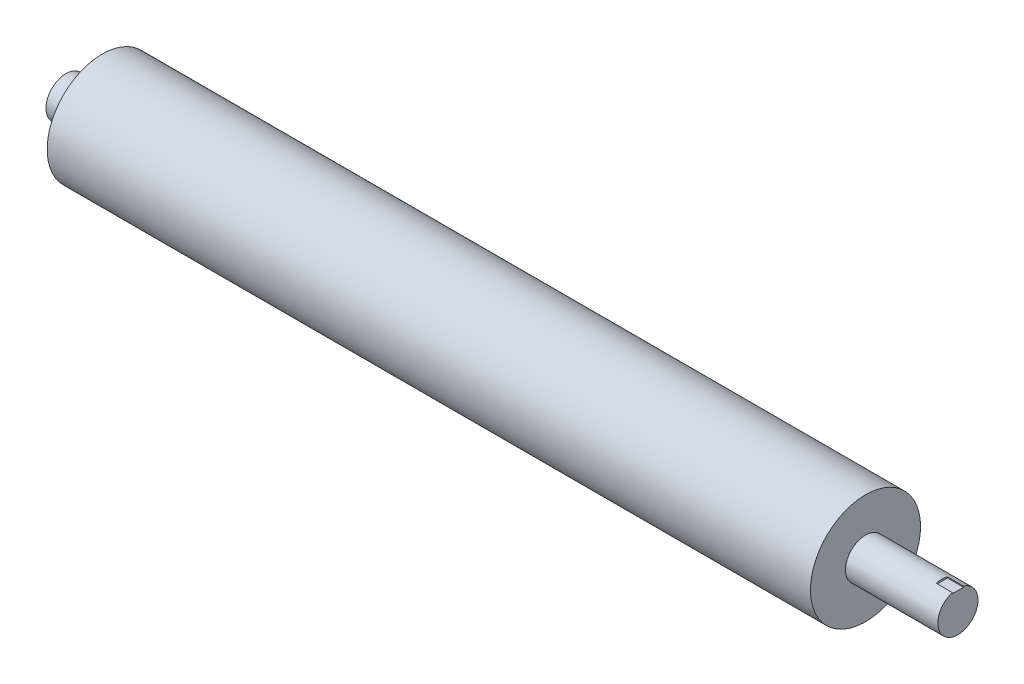
ISO-10303-21;
HEADER;
FILE_DESCRIPTION(('STEP AP214'),'2;1');
FILE_NAME('part.step','',(''),(''),'','','');
FILE_SCHEMA(('AUTOMOTIVE_DESIGN { 1 0 10303 214 1 1 1 1 }'));
ENDSEC;
DATA;
#1=APPLICATION_CONTEXT('core data for automotive mechanical design processes');
#2=APPLICATION_PROTOCOL_DEFINITION('international standard','automotive_design',2000,#1);
#3=PRODUCT_CONTEXT('',#1,'mechanical');
#4=PRODUCT('Part','Part','',(#3));
#5=PRODUCT_RELATED_PRODUCT_CATEGORY('part','',(#4));
#6=PRODUCT_DEFINITION_FORMATION('','',#4);
#7=PRODUCT_DEFINITION_CONTEXT('part definition',#1,'design');
#8=PRODUCT_DEFINITION('design','',#6,#7);
#9=PRODUCT_DEFINITION_SHAPE('','',#8);
#10=(LENGTH_UNIT() NAMED_UNIT(*) SI_UNIT(.MILLI.,.METRE.));
#11=(NAMED_UNIT(*) PLANE_ANGLE_UNIT() SI_UNIT($,.RADIAN.));
#12=(NAMED_UNIT(*) SI_UNIT($,.STERADIAN.) SOLID_ANGLE_UNIT());
#13=UNCERTAINTY_MEASURE_WITH_UNIT(LENGTH_MEASURE(1.E-05),#10,'distance_accuracy_value','');
#14=(GEOMETRIC_REPRESENTATION_CONTEXT(3) GLOBAL_UNCERTAINTY_ASSIGNED_CONTEXT((#13)) GLOBAL_UNIT_ASSIGNED_CONTEXT((#10,
#11,#12)) REPRESENTATION_CONTEXT('',''));
#15=CARTESIAN_POINT('',(0.,0.,0.));
#16=DIRECTION('',(0.,0.,1.));
#17=DIRECTION('',(1.,0.,0.));
#18=AXIS2_PLACEMENT_3D('',#15,#16,#17);
#19=CARTESIAN_POINT('',(1180.,0.,0.));
#20=DIRECTION('',(1.,0.,0.));
#21=DIRECTION('',(0.,0.,-1.));
#22=AXIS2_PLACEMENT_3D('',#19,#20,#21);
#23=PLANE('',#22);
#24=DIRECTION('',(0.,-1.,0.));
#25=VECTOR('',#24,1.);
#26=CARTESIAN_POINT('',(1180.,45.3999999999993,13.9999999999998));
#27=LINE('',#26,#25);
#28=CARTESIAN_POINT('',(1180.,47.9999999999993,13.9999999999998));
#29=VERTEX_POINT('',#28);
#30=CARTESIAN_POINT('',(1180.,45.3999999999993,13.9999999999998));
#31=VERTEX_POINT('',#30);
#32=EDGE_CURVE('E88',#29,#31,#27,.T.);
#33=ORIENTED_EDGE('',*,*,#32,.F.);
#34=CARTESIAN_POINT('',(1180.,0.,-1.44508322299388E-13));
#35=DIRECTION('',(1.,0.,0.));
#36=DIRECTION('',(0.,0.,-1.));
#37=AXIS2_PLACEMENT_3D('',#34,#35,#36);
#38=CIRCLE('',#37,49.9999999999994);
#39=CARTESIAN_POINT('',(1180.,47.9999999999993,-14.0000000000002));
#40=VERTEX_POINT('',#39);
#41=EDGE_CURVE('E118',#29,#40,#38,.T.);
#42=ORIENTED_EDGE('',*,*,#41,.T.);
#43=DIRECTION('',(0.,1.,0.));
#44=VECTOR('',#43,1.);
#45=CARTESIAN_POINT('',(1180.,45.3999999999993,-14.0000000000002));
#46=LINE('',#45,#44);
#47=CARTESIAN_POINT('',(1180.,45.3999999999993,-14.0000000000002));
#48=VERTEX_POINT('',#47);
#49=EDGE_CURVE('E82',#48,#40,#46,.T.);
#50=ORIENTED_EDGE('',*,*,#49,.F.);
#51=DIRECTION('',(0.,0.,-1.));
#52=VECTOR('',#51,1.);
#53=CARTESIAN_POINT('',(1180.,45.3999999999993,-14.0000000000002));
#54=LINE('',#53,#52);
#55=EDGE_CURVE('E99',#31,#48,#54,.T.);
#56=ORIENTED_EDGE('',*,*,#55,.F.);
#57=EDGE_LOOP('',(#33,#42,#50,#56));
#58=FACE_BOUND('',#57,.T.);
#59=ADVANCED_FACE('F39',(#58),#23,.T.);
#60=CARTESIAN_POINT('',(0.,0.,0.));
#61=DIRECTION('',(1.,0.,0.));
#62=DIRECTION('',(0.,0.,-1.));
#63=AXIS2_PLACEMENT_3D('',#60,#61,#62);
#64=CYLINDRICAL_SURFACE('',#63,49.9999999999994);
#65=DIRECTION('',(1.,0.,0.));
#66=VECTOR('',#65,1.);
#67=CARTESIAN_POINT('',(0.,47.9999999999993,14.));
#68=LINE('',#67,#66);
#69=CARTESIAN_POINT('',(1140.,47.9999999999993,13.9999999999999));
#70=VERTEX_POINT('',#69);
#71=EDGE_CURVE('E11',#70,#29,#68,.T.);
#72=ORIENTED_EDGE('',*,*,#71,.F.);
#73=CARTESIAN_POINT('',(1140.,0.,-1.39609735102798E-13));
#74=DIRECTION('',(1.,0.,0.));
#75=DIRECTION('',(0.,0.,-1.));
#76=AXIS2_PLACEMENT_3D('',#73,#74,#75);
#77=CIRCLE('',#76,49.9999999999994);
#78=CARTESIAN_POINT('',(1140.,47.9999999999993,-14.0000000000001));
#79=VERTEX_POINT('',#78);
#80=EDGE_CURVE('E58',#70,#79,#77,.F.);
#81=ORIENTED_EDGE('',*,*,#80,.T.);
#82=DIRECTION('',(1.,0.,0.));
#83=VECTOR('',#82,1.);
#84=CARTESIAN_POINT('',(0.,47.9999999999993,-14.));
#85=LINE('',#84,#83);
#86=EDGE_CURVE('E46',#40,#79,#85,.F.);
#87=ORIENTED_EDGE('',*,*,#86,.F.);
#88=ORIENTED_EDGE('',*,*,#41,.F.);
#89=EDGE_LOOP('',(#72,#81,#87,#88));
#90=FACE_BOUND('',#89,.T.);
#91=CARTESIAN_POINT('',(950.,0.,-1.16341445918999E-13));
#92=DIRECTION('',(1.,0.,0.));
#93=DIRECTION('',(0.,0.,-1.));
#94=AXIS2_PLACEMENT_3D('',#91,#92,#93);
#95=CIRCLE('',#94,49.9999999999994);
#96=CARTESIAN_POINT('',(950.,0.,-49.9999999999995));
#97=VERTEX_POINT('',#96);
#98=EDGE_CURVE('E115',#97,#97,#95,.T.);
#99=ORIENTED_EDGE('',*,*,#98,.T.);
#100=EDGE_LOOP('',(#99));
#101=FACE_BOUND('',#100,.T.);
#102=ADVANCED_FACE('F127',(#90,#101),#64,.T.);
#103=CARTESIAN_POINT('',(950.,0.,-49.9999999999995));
#104=DIRECTION('',(1.,0.,0.));
#105=DIRECTION('',(0.,0.,-1.));
#106=AXIS2_PLACEMENT_3D('',#103,#104,#105);
#107=PLANE('',#106);
#108=CARTESIAN_POINT('',(950.,0.,-1.16341445918999E-13));
#109=DIRECTION('',(1.,0.,0.));
#110=DIRECTION('',(0.,0.,-1.));
#111=AXIS2_PLACEMENT_3D('',#108,#109,#110);
#112=CIRCLE('',#111,137.);
#113=CARTESIAN_POINT('',(950.,0.,-137.));
#114=VERTEX_POINT('',#113);
#115=EDGE_CURVE('E112',#114,#114,#112,.T.);
#116=ORIENTED_EDGE('',*,*,#115,.T.);
#117=EDGE_LOOP('',(#116));
#118=FACE_BOUND('',#117,.T.);
#119=ORIENTED_EDGE('',*,*,#98,.F.);
#120=EDGE_LOOP('',(#119));
#121=FACE_BOUND('',#120,.T.);
#122=ADVANCED_FACE('F135',(#118,#121),#107,.T.);
#123=CARTESIAN_POINT('',(0.,0.,0.));
#124=DIRECTION('',(1.,0.,0.));
#125=DIRECTION('',(0.,0.,-1.));
#126=AXIS2_PLACEMENT_3D('',#123,#124,#125);
#127=CYLINDRICAL_SURFACE('',#126,137.);
#128=CARTESIAN_POINT('',(-950.,0.,1.16341445918999E-13));
#129=DIRECTION('',(1.,0.,0.));
#130=DIRECTION('',(0.,0.,-1.));
#131=AXIS2_PLACEMENT_3D('',#128,#129,#130);
#132=CIRCLE('',#131,137.);
#133=CARTESIAN_POINT('',(-950.,0.,-136.999999999999));
#134=VERTEX_POINT('',#133);
#135=EDGE_CURVE('E109',#134,#134,#132,.T.);
#136=ORIENTED_EDGE('',*,*,#135,.T.);
#137=EDGE_LOOP('',(#136));
#138=FACE_BOUND('',#137,.T.);
#139=ORIENTED_EDGE('',*,*,#115,.F.);
#140=EDGE_LOOP('',(#139));
#141=FACE_BOUND('',#140,.T.);
#142=ADVANCED_FACE('F140',(#138,#141),#127,.T.);
#143=CARTESIAN_POINT('',(-950.,0.,-49.9999999999995));
#144=DIRECTION('',(-1.,0.,0.));
#145=DIRECTION('',(0.,0.,1.));
#146=AXIS2_PLACEMENT_3D('',#143,#144,#145);
#147=PLANE('',#146);
#148=CARTESIAN_POINT('',(-950.,0.,1.16341445918999E-13));
#149=DIRECTION('',(1.,0.,0.));
#150=DIRECTION('',(0.,0.,-1.));
#151=AXIS2_PLACEMENT_3D('',#148,#149,#150);
#152=CIRCLE('',#151,49.9999999999996);
#153=CARTESIAN_POINT('',(-950.,0.,-49.9999999999995));
#154=VERTEX_POINT('',#153);
#155=EDGE_CURVE('E106',#154,#154,#152,.T.);
#156=ORIENTED_EDGE('',*,*,#155,.T.);
#157=EDGE_LOOP('',(#156));
#158=FACE_BOUND('',#157,.T.);
#159=ORIENTED_EDGE('',*,*,#135,.F.);
#160=EDGE_LOOP('',(#159));
#161=FACE_BOUND('',#160,.T.);
#162=ADVANCED_FACE('F146',(#158,#161),#147,.T.);
#163=CARTESIAN_POINT('',(0.,0.,0.));
#164=DIRECTION('',(1.,0.,0.));
#165=DIRECTION('',(0.,0.,-1.));
#166=AXIS2_PLACEMENT_3D('',#163,#164,#165);
#167=CYLINDRICAL_SURFACE('',#166,49.9999999999996);
#168=CARTESIAN_POINT('',(-1040.,0.,1.27363267111325E-13));
#169=DIRECTION('',(1.,0.,0.));
#170=DIRECTION('',(0.,0.,-1.));
#171=AXIS2_PLACEMENT_3D('',#168,#169,#170);
#172=CIRCLE('',#171,49.9999999999996);
#173=CARTESIAN_POINT('',(-1040.,0.,-49.9999999999995));
#174=VERTEX_POINT('',#173);
#175=EDGE_CURVE('E102',#174,#174,#172,.T.);
#176=ORIENTED_EDGE('',*,*,#175,.T.);
#177=EDGE_LOOP('',(#176));
#178=FACE_BOUND('',#177,.T.);
#179=ORIENTED_EDGE('',*,*,#155,.F.);
#180=EDGE_LOOP('',(#179));
#181=FACE_BOUND('',#180,.T.);
#182=ADVANCED_FACE('F150',(#178,#181),#167,.T.);
#183=CARTESIAN_POINT('',(-1040.,0.,1.27363267111325E-13));
#184=DIRECTION('',(-1.,0.,0.));
#185=DIRECTION('',(0.,0.,1.));
#186=AXIS2_PLACEMENT_3D('',#183,#184,#185);
#187=PLANE('',#186);
#188=ORIENTED_EDGE('',*,*,#175,.F.);
#189=EDGE_LOOP('',(#188));
#190=FACE_BOUND('',#189,.T.);
#191=ADVANCED_FACE('F154',(#190),#187,.T.);
#192=CARTESIAN_POINT('',(1140.,45.3999999999993,13.9999999999999));
#193=DIRECTION('',(0.,0.,1.));
#194=DIRECTION('',(1.,0.,0.));
#195=AXIS2_PLACEMENT_3D('',#192,#193,#194);
#196=PLANE('',#195);
#197=ORIENTED_EDGE('',*,*,#71,.T.);
#198=ORIENTED_EDGE('',*,*,#32,.T.);
#199=DIRECTION('',(1.,0.,0.));
#200=VECTOR('',#199,1.);
#201=CARTESIAN_POINT('',(1140.,45.3999999999993,13.9999999999999));
#202=LINE('',#201,#200);
#203=CARTESIAN_POINT('',(1140.,45.3999999999993,13.9999999999999));
#204=VERTEX_POINT('',#203);
#205=EDGE_CURVE('E85',#204,#31,#202,.T.);
#206=ORIENTED_EDGE('',*,*,#205,.F.);
#207=DIRECTION('',(0.,-1.,0.));
#208=VECTOR('',#207,1.);
#209=CARTESIAN_POINT('',(1140.,45.3999999999993,13.9999999999999));
#210=LINE('',#209,#208);
#211=EDGE_CURVE('E75',#70,#204,#210,.T.);
#212=ORIENTED_EDGE('',*,*,#211,.F.);
#213=EDGE_LOOP('',(#197,#198,#206,#212));
#214=FACE_BOUND('',#213,.T.);
#215=ADVANCED_FACE('F86',(#214),#196,.F.);
#216=CARTESIAN_POINT('',(1140.,45.3999999999993,-14.0000000000001));
#217=DIRECTION('',(0.,0.,-1.));
#218=DIRECTION('',(-1.,0.,0.));
#219=AXIS2_PLACEMENT_3D('',#216,#217,#218);
#220=PLANE('',#219);
#221=ORIENTED_EDGE('',*,*,#86,.T.);
#222=DIRECTION('',(0.,1.,0.));
#223=VECTOR('',#222,1.);
#224=CARTESIAN_POINT('',(1140.,45.3999999999993,-14.0000000000001));
#225=LINE('',#224,#223);
#226=CARTESIAN_POINT('',(1140.,45.3999999999993,-14.0000000000001));
#227=VERTEX_POINT('',#226);
#228=EDGE_CURVE('E53',#227,#79,#225,.T.);
#229=ORIENTED_EDGE('',*,*,#228,.F.);
#230=DIRECTION('',(1.,0.,0.));
#231=VECTOR('',#230,1.);
#232=CARTESIAN_POINT('',(1140.,45.3999999999993,-14.0000000000001));
#233=LINE('',#232,#231);
#234=EDGE_CURVE('E92',#227,#48,#233,.T.);
#235=ORIENTED_EDGE('',*,*,#234,.T.);
#236=ORIENTED_EDGE('',*,*,#49,.T.);
#237=EDGE_LOOP('',(#221,#229,#235,#236));
#238=FACE_BOUND('',#237,.T.);
#239=ADVANCED_FACE('F123',(#238),#220,.F.);
#240=CARTESIAN_POINT('',(1140.,45.3999999999993,-14.0000000000001));
#241=DIRECTION('',(0.,-1.,0.));
#242=DIRECTION('',(0.,0.,-1.));
#243=AXIS2_PLACEMENT_3D('',#240,#241,#242);
#244=PLANE('',#243);
#245=ORIENTED_EDGE('',*,*,#55,.T.);
#246=ORIENTED_EDGE('',*,*,#234,.F.);
#247=DIRECTION('',(0.,0.,-1.));
#248=VECTOR('',#247,1.);
#249=CARTESIAN_POINT('',(1140.,45.3999999999993,-14.0000000000001));
#250=LINE('',#249,#248);
#251=EDGE_CURVE('E79',#204,#227,#250,.T.);
#252=ORIENTED_EDGE('',*,*,#251,.F.);
#253=ORIENTED_EDGE('',*,*,#205,.T.);
#254=EDGE_LOOP('',(#245,#246,#252,#253));
#255=FACE_BOUND('',#254,.T.);
#256=ADVANCED_FACE('F94',(#255),#244,.F.);
#257=CARTESIAN_POINT('',(1140.,0.,0.));
#258=DIRECTION('',(1.,0.,0.));
#259=DIRECTION('',(0.,0.,-1.));
#260=AXIS2_PLACEMENT_3D('',#257,#258,#259);
#261=PLANE('',#260);
#262=ORIENTED_EDGE('',*,*,#211,.T.);
#263=ORIENTED_EDGE('',*,*,#251,.T.);
#264=ORIENTED_EDGE('',*,*,#228,.T.);
#265=ORIENTED_EDGE('',*,*,#80,.F.);
#266=EDGE_LOOP('',(#262,#263,#264,#265));
#267=FACE_BOUND('',#266,.T.);
#268=ADVANCED_FACE('F77',(#267),#261,.T.);
#269=CLOSED_SHELL('',(#59,#102,#122,#142,#162,#182,#191,#215,#239,#256,#268));
#270=MANIFOLD_SOLID_BREP('B2',#269);
#271=ADVANCED_BREP_SHAPE_REPRESENTATION('',(#18,#270),#14);
#272=SHAPE_DEFINITION_REPRESENTATION(#9,#271);
ENDSEC;
END-ISO-10303-21;
